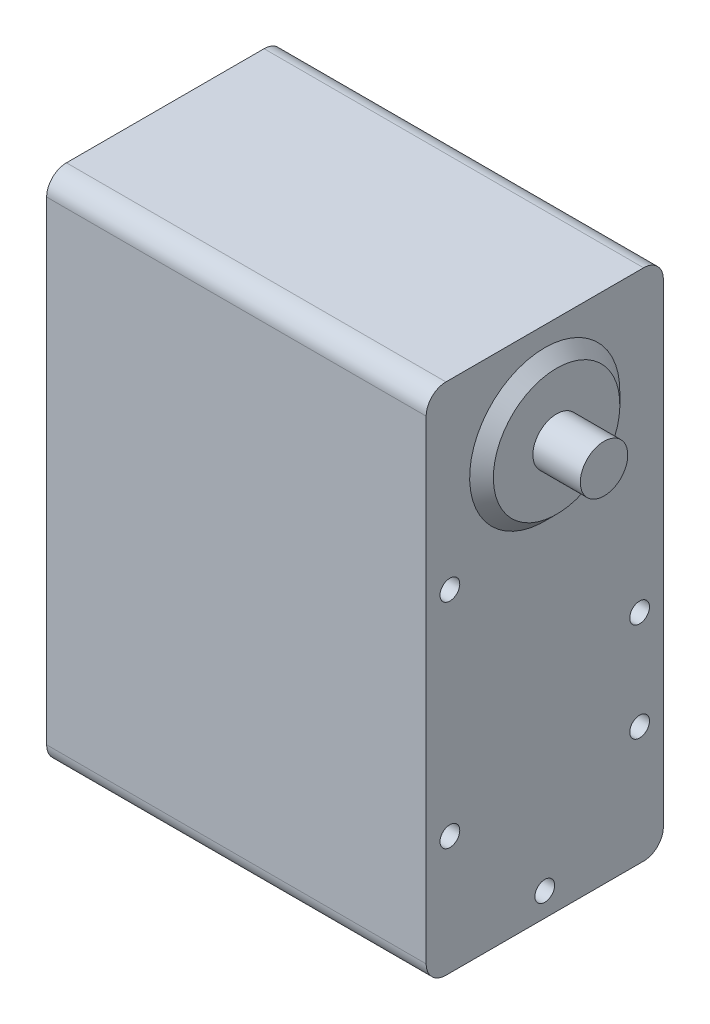
ISO-10303-21;
HEADER;
FILE_DESCRIPTION(('STEP AP214'),'2;1');
FILE_NAME('part.step','',(''),(''),'','','');
FILE_SCHEMA(('AUTOMOTIVE_DESIGN { 1 0 10303 214 1 1 1 1 }'));
ENDSEC;
DATA;
#1=APPLICATION_CONTEXT('core data for automotive mechanical design processes');
#2=APPLICATION_PROTOCOL_DEFINITION('international standard','automotive_design',2000,#1);
#3=PRODUCT_CONTEXT('',#1,'mechanical');
#4=PRODUCT('Part','Part','',(#3));
#5=PRODUCT_RELATED_PRODUCT_CATEGORY('part','',(#4));
#6=PRODUCT_DEFINITION_FORMATION('','',#4);
#7=PRODUCT_DEFINITION_CONTEXT('part definition',#1,'design');
#8=PRODUCT_DEFINITION('design','',#6,#7);
#9=PRODUCT_DEFINITION_SHAPE('','',#8);
#10=(LENGTH_UNIT() NAMED_UNIT(*) SI_UNIT(.MILLI.,.METRE.));
#11=(NAMED_UNIT(*) PLANE_ANGLE_UNIT() SI_UNIT($,.RADIAN.));
#12=(NAMED_UNIT(*) SI_UNIT($,.STERADIAN.) SOLID_ANGLE_UNIT());
#13=UNCERTAINTY_MEASURE_WITH_UNIT(LENGTH_MEASURE(1.E-05),#10,'distance_accuracy_value','');
#14=(GEOMETRIC_REPRESENTATION_CONTEXT(3) GLOBAL_UNCERTAINTY_ASSIGNED_CONTEXT((#13)) GLOBAL_UNIT_ASSIGNED_CONTEXT((#10,
#11,#12)) REPRESENTATION_CONTEXT('',''));
#15=CARTESIAN_POINT('',(0.,0.,0.));
#16=DIRECTION('',(0.,0.,1.));
#17=DIRECTION('',(1.,0.,0.));
#18=AXIS2_PLACEMENT_3D('',#15,#16,#17);
#19=CARTESIAN_POINT('',(-24.,-32.5,-15.));
#20=DIRECTION('',(-1.,0.,0.));
#21=DIRECTION('',(0.,-1.,0.));
#22=AXIS2_PLACEMENT_3D('',#19,#20,#21);
#23=PLANE('',#22);
#24=CARTESIAN_POINT('',(-24.,20.5,0.));
#25=DIRECTION('',(-1.,0.,0.));
#26=DIRECTION('',(0.,-1.,0.));
#27=AXIS2_PLACEMENT_3D('',#24,#25,#26);
#28=CIRCLE('',#27,9.5);
#29=CARTESIAN_POINT('',(-24.,11.,0.));
#30=VERTEX_POINT('',#29);
#31=EDGE_CURVE('E229',#30,#30,#28,.T.);
#32=ORIENTED_EDGE('',*,*,#31,.F.);
#33=EDGE_LOOP('',(#32));
#34=FACE_BOUND('',#33,.T.);
#35=CARTESIAN_POINT('',(-24.,-29.4999999999992,-12.));
#36=DIRECTION('',(-1.,0.,0.));
#37=DIRECTION('',(0.,-1.,0.));
#38=AXIS2_PLACEMENT_3D('',#35,#36,#37);
#39=CIRCLE('',#38,1.25);
#40=CARTESIAN_POINT('',(-24.,-30.7499999999992,-12.));
#41=VERTEX_POINT('',#40);
#42=EDGE_CURVE('E217',#41,#41,#39,.T.);
#43=ORIENTED_EDGE('',*,*,#42,.F.);
#44=EDGE_LOOP('',(#43));
#45=FACE_BOUND('',#44,.T.);
#46=CARTESIAN_POINT('',(-24.,5.50000000000077,-12.));
#47=DIRECTION('',(-1.,0.,0.));
#48=DIRECTION('',(0.,-1.,0.));
#49=AXIS2_PLACEMENT_3D('',#46,#47,#48);
#50=CIRCLE('',#49,1.25);
#51=CARTESIAN_POINT('',(-24.,4.25000000000077,-12.));
#52=VERTEX_POINT('',#51);
#53=EDGE_CURVE('E206',#52,#52,#50,.T.);
#54=ORIENTED_EDGE('',*,*,#53,.F.);
#55=EDGE_LOOP('',(#54));
#56=FACE_BOUND('',#55,.T.);
#57=CARTESIAN_POINT('',(-24.,29.5,-12.));
#58=DIRECTION('',(-1.,0.,0.));
#59=DIRECTION('',(0.,-1.,0.));
#60=AXIS2_PLACEMENT_3D('',#57,#58,#59);
#61=CIRCLE('',#60,1.25);
#62=CARTESIAN_POINT('',(-24.,28.25,-12.));
#63=VERTEX_POINT('',#62);
#64=EDGE_CURVE('E205',#63,#63,#61,.T.);
#65=ORIENTED_EDGE('',*,*,#64,.F.);
#66=EDGE_LOOP('',(#65));
#67=FACE_BOUND('',#66,.T.);
#68=CARTESIAN_POINT('',(-24.,5.50000000000001,12.));
#69=DIRECTION('',(-1.,0.,0.));
#70=DIRECTION('',(0.,-1.,0.));
#71=AXIS2_PLACEMENT_3D('',#68,#69,#70);
#72=CIRCLE('',#71,1.25);
#73=CARTESIAN_POINT('',(-24.,4.25000000000001,12.));
#74=VERTEX_POINT('',#73);
#75=EDGE_CURVE('E199',#74,#74,#72,.T.);
#76=ORIENTED_EDGE('',*,*,#75,.F.);
#77=EDGE_LOOP('',(#76));
#78=FACE_BOUND('',#77,.T.);
#79=CARTESIAN_POINT('',(-24.,-29.4999999999992,12.));
#80=DIRECTION('',(-1.,0.,0.));
#81=DIRECTION('',(0.,-1.,0.));
#82=AXIS2_PLACEMENT_3D('',#79,#80,#81);
#83=CIRCLE('',#82,1.25);
#84=CARTESIAN_POINT('',(-24.,-30.7499999999992,12.));
#85=VERTEX_POINT('',#84);
#86=EDGE_CURVE('E218',#85,#85,#83,.T.);
#87=ORIENTED_EDGE('',*,*,#86,.F.);
#88=EDGE_LOOP('',(#87));
#89=FACE_BOUND('',#88,.T.);
#90=CARTESIAN_POINT('',(-24.,29.5,12.));
#91=DIRECTION('',(-1.,0.,0.));
#92=DIRECTION('',(0.,-1.,0.));
#93=AXIS2_PLACEMENT_3D('',#90,#91,#92);
#94=CIRCLE('',#93,1.25);
#95=CARTESIAN_POINT('',(-24.,28.25,12.));
#96=VERTEX_POINT('',#95);
#97=EDGE_CURVE('E196',#96,#96,#94,.T.);
#98=ORIENTED_EDGE('',*,*,#97,.F.);
#99=EDGE_LOOP('',(#98));
#100=FACE_BOUND('',#99,.T.);
#101=DIRECTION('',(0.,0.,1.));
#102=VECTOR('',#101,1.);
#103=CARTESIAN_POINT('',(-24.,32.5,-15.));
#104=LINE('',#103,#102);
#105=CARTESIAN_POINT('',(-24.,32.5,-12.5));
#106=VERTEX_POINT('',#105);
#107=CARTESIAN_POINT('',(-24.,32.5,12.5));
#108=VERTEX_POINT('',#107);
#109=EDGE_CURVE('E126',#106,#108,#104,.T.);
#110=ORIENTED_EDGE('',*,*,#109,.F.);
#111=CARTESIAN_POINT('',(-24.,30.,-12.5));
#112=DIRECTION('',(-1.,0.,0.));
#113=DIRECTION('',(0.,-1.,0.));
#114=AXIS2_PLACEMENT_3D('',#111,#112,#113);
#115=CIRCLE('',#114,2.5);
#116=CARTESIAN_POINT('',(-24.,30.,-15.));
#117=VERTEX_POINT('',#116);
#118=EDGE_CURVE('E109',#106,#117,#115,.T.);
#119=ORIENTED_EDGE('',*,*,#118,.T.);
#120=DIRECTION('',(0.,-1.,0.));
#121=VECTOR('',#120,1.);
#122=CARTESIAN_POINT('',(-24.,-32.5,-15.));
#123=LINE('',#122,#121);
#124=CARTESIAN_POINT('',(-24.,-30.,-15.));
#125=VERTEX_POINT('',#124);
#126=EDGE_CURVE('E191',#117,#125,#123,.T.);
#127=ORIENTED_EDGE('',*,*,#126,.T.);
#128=CARTESIAN_POINT('',(-24.,-30.,-12.5));
#129=DIRECTION('',(-1.,0.,0.));
#130=DIRECTION('',(0.,-1.,0.));
#131=AXIS2_PLACEMENT_3D('',#128,#129,#130);
#132=CIRCLE('',#131,2.5);
#133=CARTESIAN_POINT('',(-24.,-32.5,-12.5));
#134=VERTEX_POINT('',#133);
#135=EDGE_CURVE('E157',#125,#134,#132,.T.);
#136=ORIENTED_EDGE('',*,*,#135,.T.);
#137=DIRECTION('',(0.,0.,1.));
#138=VECTOR('',#137,1.);
#139=CARTESIAN_POINT('',(-24.,-32.5,-15.));
#140=LINE('',#139,#138);
#141=CARTESIAN_POINT('',(-24.,-32.5,12.5));
#142=VERTEX_POINT('',#141);
#143=EDGE_CURVE('E146',#134,#142,#140,.T.);
#144=ORIENTED_EDGE('',*,*,#143,.T.);
#145=CARTESIAN_POINT('',(-24.,-30.,12.5));
#146=DIRECTION('',(-1.,0.,0.));
#147=DIRECTION('',(0.,-1.,0.));
#148=AXIS2_PLACEMENT_3D('',#145,#146,#147);
#149=CIRCLE('',#148,2.5);
#150=CARTESIAN_POINT('',(-24.,-30.,15.));
#151=VERTEX_POINT('',#150);
#152=EDGE_CURVE('E130',#142,#151,#149,.T.);
#153=ORIENTED_EDGE('',*,*,#152,.T.);
#154=DIRECTION('',(0.,-1.,0.));
#155=VECTOR('',#154,1.);
#156=CARTESIAN_POINT('',(-24.,-32.5,15.));
#157=LINE('',#156,#155);
#158=CARTESIAN_POINT('',(-24.,30.,15.));
#159=VERTEX_POINT('',#158);
#160=EDGE_CURVE('E187',#159,#151,#157,.T.);
#161=ORIENTED_EDGE('',*,*,#160,.F.);
#162=CARTESIAN_POINT('',(-24.,30.,12.5));
#163=DIRECTION('',(-1.,0.,0.));
#164=DIRECTION('',(0.,-1.,0.));
#165=AXIS2_PLACEMENT_3D('',#162,#163,#164);
#166=CIRCLE('',#165,2.5);
#167=EDGE_CURVE('E120',#159,#108,#166,.T.);
#168=ORIENTED_EDGE('',*,*,#167,.T.);
#169=EDGE_LOOP('',(#110,#119,#127,#136,#144,#153,#161,#168));
#170=FACE_BOUND('',#169,.T.);
#171=ADVANCED_FACE('F43',(#34,#45,#56,#67,#78,#89,#100,#170),#23,.T.);
#172=CARTESIAN_POINT('',(-24.,32.5,-15.));
#173=DIRECTION('',(0.,1.,0.));
#174=DIRECTION('',(0.,0.,1.));
#175=AXIS2_PLACEMENT_3D('',#172,#173,#174);
#176=PLANE('',#175);
#177=DIRECTION('',(0.,0.,1.));
#178=VECTOR('',#177,1.);
#179=CARTESIAN_POINT('',(24.,32.5,-15.));
#180=LINE('',#179,#178);
#181=CARTESIAN_POINT('',(24.,32.5,-12.5));
#182=VERTEX_POINT('',#181);
#183=CARTESIAN_POINT('',(24.,32.5,12.5));
#184=VERTEX_POINT('',#183);
#185=EDGE_CURVE('E129',#182,#184,#180,.T.);
#186=ORIENTED_EDGE('',*,*,#185,.F.);
#187=DIRECTION('',(-1.,0.,0.));
#188=VECTOR('',#187,1.);
#189=CARTESIAN_POINT('',(-24.,32.5,-12.5));
#190=LINE('',#189,#188);
#191=EDGE_CURVE('E113',#182,#106,#190,.T.);
#192=ORIENTED_EDGE('',*,*,#191,.T.);
#193=ORIENTED_EDGE('',*,*,#109,.T.);
#194=DIRECTION('',(-1.,0.,0.));
#195=VECTOR('',#194,1.);
#196=CARTESIAN_POINT('',(24.,32.5,12.5));
#197=LINE('',#196,#195);
#198=EDGE_CURVE('E131',#108,#184,#197,.F.);
#199=ORIENTED_EDGE('',*,*,#198,.T.);
#200=EDGE_LOOP('',(#186,#192,#193,#199));
#201=FACE_BOUND('',#200,.T.);
#202=ADVANCED_FACE('F125',(#201),#176,.T.);
#203=CARTESIAN_POINT('',(24.,-32.5,-15.));
#204=DIRECTION('',(1.,0.,0.));
#205=DIRECTION('',(0.,1.,0.));
#206=AXIS2_PLACEMENT_3D('',#203,#204,#205);
#207=PLANE('',#206);
#208=CARTESIAN_POINT('',(24.,9.50000000000001,12.000000020224));
#209=DIRECTION('',(1.,0.,0.));
#210=DIRECTION('',(0.,1.,0.));
#211=AXIS2_PLACEMENT_3D('',#208,#209,#210);
#212=CIRCLE('',#211,1.25);
#213=CARTESIAN_POINT('',(24.,10.75,12.000000020224));
#214=VERTEX_POINT('',#213);
#215=EDGE_CURVE('E270',#214,#214,#212,.T.);
#216=ORIENTED_EDGE('',*,*,#215,.F.);
#217=EDGE_LOOP('',(#216));
#218=FACE_BOUND('',#217,.T.);
#219=CARTESIAN_POINT('',(24.,-17.5,12.0000000202238));
#220=DIRECTION('',(1.,0.,0.));
#221=DIRECTION('',(0.,1.,0.));
#222=AXIS2_PLACEMENT_3D('',#219,#220,#221);
#223=CIRCLE('',#222,1.25);
#224=CARTESIAN_POINT('',(24.,-16.25,12.0000000202238));
#225=VERTEX_POINT('',#224);
#226=EDGE_CURVE('E267',#225,#225,#223,.T.);
#227=ORIENTED_EDGE('',*,*,#226,.F.);
#228=EDGE_LOOP('',(#227));
#229=FACE_BOUND('',#228,.T.);
#230=CARTESIAN_POINT('',(24.,-29.5,0.));
#231=DIRECTION('',(1.,0.,0.));
#232=DIRECTION('',(0.,1.,0.));
#233=AXIS2_PLACEMENT_3D('',#230,#231,#232);
#234=CIRCLE('',#233,1.24999999408708);
#235=CARTESIAN_POINT('',(24.,-28.2500000059129,0.));
#236=VERTEX_POINT('',#235);
#237=EDGE_CURVE('E261',#236,#236,#234,.T.);
#238=ORIENTED_EDGE('',*,*,#237,.F.);
#239=EDGE_LOOP('',(#238));
#240=FACE_BOUND('',#239,.T.);
#241=CARTESIAN_POINT('',(24.,-17.5,-12.0000000202241));
#242=DIRECTION('',(1.,0.,0.));
#243=DIRECTION('',(0.,1.,0.));
#244=AXIS2_PLACEMENT_3D('',#241,#242,#243);
#245=CIRCLE('',#244,1.25000000000001);
#246=CARTESIAN_POINT('',(24.,-16.25,-12.0000000202241));
#247=VERTEX_POINT('',#246);
#248=EDGE_CURVE('E255',#247,#247,#245,.T.);
#249=ORIENTED_EDGE('',*,*,#248,.F.);
#250=EDGE_LOOP('',(#249));
#251=FACE_BOUND('',#250,.T.);
#252=CARTESIAN_POINT('',(24.,-4.99999999999999,-11.9999999797799));
#253=DIRECTION('',(1.,0.,0.));
#254=DIRECTION('',(0.,1.,0.));
#255=AXIS2_PLACEMENT_3D('',#252,#253,#254);
#256=CIRCLE('',#255,1.25);
#257=CARTESIAN_POINT('',(24.,-3.74999999999999,-11.9999999797799));
#258=VERTEX_POINT('',#257);
#259=EDGE_CURVE('E249',#258,#258,#256,.T.);
#260=ORIENTED_EDGE('',*,*,#259,.F.);
#261=EDGE_LOOP('',(#260));
#262=FACE_BOUND('',#261,.T.);
#263=CARTESIAN_POINT('',(24.,20.5,0.));
#264=DIRECTION('',(1.,0.,0.));
#265=DIRECTION('',(0.,1.,0.));
#266=AXIS2_PLACEMENT_3D('',#263,#264,#265);
#267=CIRCLE('',#266,9.5);
#268=CARTESIAN_POINT('',(24.,30.,0.));
#269=VERTEX_POINT('',#268);
#270=EDGE_CURVE('E149',#269,#269,#267,.T.);
#271=ORIENTED_EDGE('',*,*,#270,.F.);
#272=EDGE_LOOP('',(#271));
#273=FACE_BOUND('',#272,.T.);
#274=DIRECTION('',(0.,1.,0.));
#275=VECTOR('',#274,1.);
#276=CARTESIAN_POINT('',(24.,-32.5,-15.));
#277=LINE('',#276,#275);
#278=CARTESIAN_POINT('',(24.,-30.,-15.));
#279=VERTEX_POINT('',#278);
#280=CARTESIAN_POINT('',(24.,30.,-15.));
#281=VERTEX_POINT('',#280);
#282=EDGE_CURVE('E142',#279,#281,#277,.T.);
#283=ORIENTED_EDGE('',*,*,#282,.T.);
#284=CARTESIAN_POINT('',(24.,30.,-12.5));
#285=DIRECTION('',(1.,0.,0.));
#286=DIRECTION('',(0.,1.,0.));
#287=AXIS2_PLACEMENT_3D('',#284,#285,#286);
#288=CIRCLE('',#287,2.5);
#289=EDGE_CURVE('E166',#281,#182,#288,.T.);
#290=ORIENTED_EDGE('',*,*,#289,.T.);
#291=ORIENTED_EDGE('',*,*,#185,.T.);
#292=CARTESIAN_POINT('',(24.,30.,12.5));
#293=DIRECTION('',(1.,0.,0.));
#294=DIRECTION('',(0.,1.,0.));
#295=AXIS2_PLACEMENT_3D('',#292,#293,#294);
#296=CIRCLE('',#295,2.5);
#297=CARTESIAN_POINT('',(24.,30.,15.));
#298=VERTEX_POINT('',#297);
#299=EDGE_CURVE('E164',#184,#298,#296,.T.);
#300=ORIENTED_EDGE('',*,*,#299,.T.);
#301=DIRECTION('',(0.,1.,0.));
#302=VECTOR('',#301,1.);
#303=CARTESIAN_POINT('',(24.,-32.5,15.));
#304=LINE('',#303,#302);
#305=CARTESIAN_POINT('',(24.,-30.,15.));
#306=VERTEX_POINT('',#305);
#307=EDGE_CURVE('E185',#306,#298,#304,.T.);
#308=ORIENTED_EDGE('',*,*,#307,.F.);
#309=CARTESIAN_POINT('',(24.,-30.,12.5));
#310=DIRECTION('',(1.,0.,0.));
#311=DIRECTION('',(0.,1.,0.));
#312=AXIS2_PLACEMENT_3D('',#309,#310,#311);
#313=CIRCLE('',#312,2.5);
#314=CARTESIAN_POINT('',(24.,-32.5,12.5));
#315=VERTEX_POINT('',#314);
#316=EDGE_CURVE('E58',#306,#315,#313,.T.);
#317=ORIENTED_EDGE('',*,*,#316,.T.);
#318=DIRECTION('',(0.,0.,1.));
#319=VECTOR('',#318,1.);
#320=CARTESIAN_POINT('',(24.,-32.5,-15.));
#321=LINE('',#320,#319);
#322=CARTESIAN_POINT('',(24.,-32.5,-12.5));
#323=VERTEX_POINT('',#322);
#324=EDGE_CURVE('E139',#323,#315,#321,.T.);
#325=ORIENTED_EDGE('',*,*,#324,.F.);
#326=CARTESIAN_POINT('',(24.,-30.,-12.5));
#327=DIRECTION('',(1.,0.,0.));
#328=DIRECTION('',(0.,1.,0.));
#329=AXIS2_PLACEMENT_3D('',#326,#327,#328);
#330=CIRCLE('',#329,2.5);
#331=EDGE_CURVE('E66',#323,#279,#330,.T.);
#332=ORIENTED_EDGE('',*,*,#331,.T.);
#333=EDGE_LOOP('',(#283,#290,#291,#300,#308,#317,#325,#332));
#334=FACE_BOUND('',#333,.T.);
#335=ADVANCED_FACE('F189',(#218,#229,#240,#251,#262,#273,#334),#207,.T.);
#336=CARTESIAN_POINT('',(-24.,-32.5,-15.));
#337=DIRECTION('',(0.,-1.,0.));
#338=DIRECTION('',(0.,0.,-1.));
#339=AXIS2_PLACEMENT_3D('',#336,#337,#338);
#340=PLANE('',#339);
#341=ORIENTED_EDGE('',*,*,#143,.F.);
#342=DIRECTION('',(1.,0.,0.));
#343=VECTOR('',#342,1.);
#344=CARTESIAN_POINT('',(-24.,-32.5,-12.5));
#345=LINE('',#344,#343);
#346=EDGE_CURVE('E11',#134,#323,#345,.T.);
#347=ORIENTED_EDGE('',*,*,#346,.T.);
#348=ORIENTED_EDGE('',*,*,#324,.T.);
#349=DIRECTION('',(1.,0.,0.));
#350=VECTOR('',#349,1.);
#351=CARTESIAN_POINT('',(-24.,-32.5,12.5));
#352=LINE('',#351,#350);
#353=EDGE_CURVE('E51',#315,#142,#352,.F.);
#354=ORIENTED_EDGE('',*,*,#353,.T.);
#355=EDGE_LOOP('',(#341,#347,#348,#354));
#356=FACE_BOUND('',#355,.T.);
#357=ADVANCED_FACE('F176',(#356),#340,.T.);
#358=CARTESIAN_POINT('',(0.,0.,-15.));
#359=DIRECTION('',(0.,0.,-1.));
#360=DIRECTION('',(-1.,0.,0.));
#361=AXIS2_PLACEMENT_3D('',#358,#359,#360);
#362=PLANE('',#361);
#363=ORIENTED_EDGE('',*,*,#126,.F.);
#364=DIRECTION('',(-1.,0.,0.));
#365=VECTOR('',#364,1.);
#366=CARTESIAN_POINT('',(0.,30.,-15.));
#367=LINE('',#366,#365);
#368=EDGE_CURVE('E114',#117,#281,#367,.F.);
#369=ORIENTED_EDGE('',*,*,#368,.T.);
#370=ORIENTED_EDGE('',*,*,#282,.F.);
#371=DIRECTION('',(1.,0.,0.));
#372=VECTOR('',#371,1.);
#373=CARTESIAN_POINT('',(0.,-30.,-15.));
#374=LINE('',#373,#372);
#375=EDGE_CURVE('E119',#279,#125,#374,.F.);
#376=ORIENTED_EDGE('',*,*,#375,.T.);
#377=EDGE_LOOP('',(#363,#369,#370,#376));
#378=FACE_BOUND('',#377,.T.);
#379=ADVANCED_FACE('F402',(#378),#362,.T.);
#380=CARTESIAN_POINT('',(0.,0.,15.));
#381=DIRECTION('',(0.,0.,-1.));
#382=DIRECTION('',(-1.,0.,0.));
#383=AXIS2_PLACEMENT_3D('',#380,#381,#382);
#384=PLANE('',#383);
#385=ORIENTED_EDGE('',*,*,#307,.T.);
#386=DIRECTION('',(-1.,0.,0.));
#387=VECTOR('',#386,1.);
#388=CARTESIAN_POINT('',(-24.,30.,15.));
#389=LINE('',#388,#387);
#390=EDGE_CURVE('E171',#298,#159,#389,.T.);
#391=ORIENTED_EDGE('',*,*,#390,.T.);
#392=ORIENTED_EDGE('',*,*,#160,.T.);
#393=DIRECTION('',(1.,0.,0.));
#394=VECTOR('',#393,1.);
#395=CARTESIAN_POINT('',(24.,-30.,15.));
#396=LINE('',#395,#394);
#397=EDGE_CURVE('E168',#151,#306,#396,.T.);
#398=ORIENTED_EDGE('',*,*,#397,.T.);
#399=EDGE_LOOP('',(#385,#391,#392,#398));
#400=FACE_BOUND('',#399,.T.);
#401=ADVANCED_FACE('F184',(#400),#384,.F.);
#402=CARTESIAN_POINT('',(-14.,29.5,12.));
#403=DIRECTION('',(-1.,0.,0.));
#404=DIRECTION('',(0.,-1.,0.));
#405=AXIS2_PLACEMENT_3D('',#402,#403,#404);
#406=CYLINDRICAL_SURFACE('',#405,1.25);
#407=CARTESIAN_POINT('',(-14.,29.5,12.));
#408=DIRECTION('',(-1.,0.,0.));
#409=DIRECTION('',(0.,-1.,0.));
#410=AXIS2_PLACEMENT_3D('',#407,#408,#409);
#411=CIRCLE('',#410,1.25);
#412=CARTESIAN_POINT('',(-14.,28.25,12.));
#413=VERTEX_POINT('',#412);
#414=EDGE_CURVE('E193',#413,#413,#411,.T.);
#415=ORIENTED_EDGE('',*,*,#414,.F.);
#416=EDGE_LOOP('',(#415));
#417=FACE_BOUND('',#416,.T.);
#418=ORIENTED_EDGE('',*,*,#97,.T.);
#419=EDGE_LOOP('',(#418));
#420=FACE_BOUND('',#419,.T.);
#421=ADVANCED_FACE('F395',(#417,#420),#406,.F.);
#422=CARTESIAN_POINT('',(-14.,29.5,12.));
#423=DIRECTION('',(-1.,0.,0.));
#424=DIRECTION('',(0.,-1.,0.));
#425=AXIS2_PLACEMENT_3D('',#422,#423,#424);
#426=PLANE('',#425);
#427=ORIENTED_EDGE('',*,*,#414,.T.);
#428=EDGE_LOOP('',(#427));
#429=FACE_BOUND('',#428,.T.);
#430=ADVANCED_FACE('F361',(#429),#426,.T.);
#431=CARTESIAN_POINT('',(-14.,-29.4999999999992,12.));
#432=DIRECTION('',(-1.,0.,0.));
#433=DIRECTION('',(0.,-1.,0.));
#434=AXIS2_PLACEMENT_3D('',#431,#432,#433);
#435=CYLINDRICAL_SURFACE('',#434,1.25);
#436=CARTESIAN_POINT('',(-14.,-29.4999999999992,12.));
#437=DIRECTION('',(-1.,0.,0.));
#438=DIRECTION('',(0.,-1.,0.));
#439=AXIS2_PLACEMENT_3D('',#436,#437,#438);
#440=CIRCLE('',#439,1.25);
#441=CARTESIAN_POINT('',(-14.,-30.7499999999992,12.));
#442=VERTEX_POINT('',#441);
#443=EDGE_CURVE('E226',#442,#442,#440,.T.);
#444=ORIENTED_EDGE('',*,*,#443,.F.);
#445=EDGE_LOOP('',(#444));
#446=FACE_BOUND('',#445,.T.);
#447=ORIENTED_EDGE('',*,*,#86,.T.);
#448=EDGE_LOOP('',(#447));
#449=FACE_BOUND('',#448,.T.);
#450=ADVANCED_FACE('F357',(#446,#449),#435,.F.);
#451=CARTESIAN_POINT('',(-14.,-29.4999999999992,12.));
#452=DIRECTION('',(-1.,0.,0.));
#453=DIRECTION('',(0.,-1.,0.));
#454=AXIS2_PLACEMENT_3D('',#451,#452,#453);
#455=PLANE('',#454);
#456=ORIENTED_EDGE('',*,*,#443,.T.);
#457=EDGE_LOOP('',(#456));
#458=FACE_BOUND('',#457,.T.);
#459=ADVANCED_FACE('F360',(#458),#455,.T.);
#460=CARTESIAN_POINT('',(-14.,5.50000000000001,12.));
#461=DIRECTION('',(-1.,0.,0.));
#462=DIRECTION('',(0.,-1.,0.));
#463=AXIS2_PLACEMENT_3D('',#460,#461,#462);
#464=CYLINDRICAL_SURFACE('',#463,1.25);
#465=CARTESIAN_POINT('',(-14.,5.50000000000001,12.));
#466=DIRECTION('',(-1.,0.,0.));
#467=DIRECTION('',(0.,-1.,0.));
#468=AXIS2_PLACEMENT_3D('',#465,#466,#467);
#469=CIRCLE('',#468,1.25);
#470=CARTESIAN_POINT('',(-14.,4.25000000000001,12.));
#471=VERTEX_POINT('',#470);
#472=EDGE_CURVE('E209',#471,#471,#469,.T.);
#473=ORIENTED_EDGE('',*,*,#472,.F.);
#474=EDGE_LOOP('',(#473));
#475=FACE_BOUND('',#474,.T.);
#476=ORIENTED_EDGE('',*,*,#75,.T.);
#477=EDGE_LOOP('',(#476));
#478=FACE_BOUND('',#477,.T.);
#479=ADVANCED_FACE('F365',(#475,#478),#464,.F.);
#480=CARTESIAN_POINT('',(-14.,5.50000000000001,12.));
#481=DIRECTION('',(-1.,0.,0.));
#482=DIRECTION('',(0.,-1.,0.));
#483=AXIS2_PLACEMENT_3D('',#480,#481,#482);
#484=PLANE('',#483);
#485=ORIENTED_EDGE('',*,*,#472,.T.);
#486=EDGE_LOOP('',(#485));
#487=FACE_BOUND('',#486,.T.);
#488=ADVANCED_FACE('F381',(#487),#484,.T.);
#489=CARTESIAN_POINT('',(-14.,29.5,-12.));
#490=DIRECTION('',(-1.,0.,0.));
#491=DIRECTION('',(0.,-1.,0.));
#492=AXIS2_PLACEMENT_3D('',#489,#490,#491);
#493=CYLINDRICAL_SURFACE('',#492,1.25);
#494=CARTESIAN_POINT('',(-14.,29.5,-12.));
#495=DIRECTION('',(-1.,0.,0.));
#496=DIRECTION('',(0.,-1.,0.));
#497=AXIS2_PLACEMENT_3D('',#494,#495,#496);
#498=CIRCLE('',#497,1.25);
#499=CARTESIAN_POINT('',(-14.,28.25,-12.));
#500=VERTEX_POINT('',#499);
#501=EDGE_CURVE('E202',#500,#500,#498,.T.);
#502=ORIENTED_EDGE('',*,*,#501,.F.);
#503=EDGE_LOOP('',(#502));
#504=FACE_BOUND('',#503,.T.);
#505=ORIENTED_EDGE('',*,*,#64,.T.);
#506=EDGE_LOOP('',(#505));
#507=FACE_BOUND('',#506,.T.);
#508=ADVANCED_FACE('F385',(#504,#507),#493,.F.);
#509=CARTESIAN_POINT('',(-14.,29.5,-12.));
#510=DIRECTION('',(-1.,0.,0.));
#511=DIRECTION('',(0.,-1.,0.));
#512=AXIS2_PLACEMENT_3D('',#509,#510,#511);
#513=PLANE('',#512);
#514=ORIENTED_EDGE('',*,*,#501,.T.);
#515=EDGE_LOOP('',(#514));
#516=FACE_BOUND('',#515,.T.);
#517=ADVANCED_FACE('F371',(#516),#513,.T.);
#518=CARTESIAN_POINT('',(-14.,5.50000000000077,-12.));
#519=DIRECTION('',(-1.,0.,0.));
#520=DIRECTION('',(0.,-1.,0.));
#521=AXIS2_PLACEMENT_3D('',#518,#519,#520);
#522=CYLINDRICAL_SURFACE('',#521,1.25);
#523=CARTESIAN_POINT('',(-14.,5.50000000000077,-12.));
#524=DIRECTION('',(-1.,0.,0.));
#525=DIRECTION('',(0.,-1.,0.));
#526=AXIS2_PLACEMENT_3D('',#523,#524,#525);
#527=CIRCLE('',#526,1.25);
#528=CARTESIAN_POINT('',(-14.,4.25000000000077,-12.));
#529=VERTEX_POINT('',#528);
#530=EDGE_CURVE('E221',#529,#529,#527,.T.);
#531=ORIENTED_EDGE('',*,*,#530,.F.);
#532=EDGE_LOOP('',(#531));
#533=FACE_BOUND('',#532,.T.);
#534=ORIENTED_EDGE('',*,*,#53,.T.);
#535=EDGE_LOOP('',(#534));
#536=FACE_BOUND('',#535,.T.);
#537=ADVANCED_FACE('F367',(#533,#536),#522,.F.);
#538=CARTESIAN_POINT('',(-14.,5.50000000000077,-12.));
#539=DIRECTION('',(-1.,0.,0.));
#540=DIRECTION('',(0.,-1.,0.));
#541=AXIS2_PLACEMENT_3D('',#538,#539,#540);
#542=PLANE('',#541);
#543=ORIENTED_EDGE('',*,*,#530,.T.);
#544=EDGE_LOOP('',(#543));
#545=FACE_BOUND('',#544,.T.);
#546=ADVANCED_FACE('F370',(#545),#542,.T.);
#547=CARTESIAN_POINT('',(-14.,-29.4999999999992,-12.));
#548=DIRECTION('',(-1.,0.,0.));
#549=DIRECTION('',(0.,-1.,0.));
#550=AXIS2_PLACEMENT_3D('',#547,#548,#549);
#551=CYLINDRICAL_SURFACE('',#550,1.25);
#552=CARTESIAN_POINT('',(-14.,-29.4999999999992,-12.));
#553=DIRECTION('',(-1.,0.,0.));
#554=DIRECTION('',(0.,-1.,0.));
#555=AXIS2_PLACEMENT_3D('',#552,#553,#554);
#556=CIRCLE('',#555,1.25);
#557=CARTESIAN_POINT('',(-14.,-30.7499999999992,-12.));
#558=VERTEX_POINT('',#557);
#559=EDGE_CURVE('E214',#558,#558,#556,.T.);
#560=ORIENTED_EDGE('',*,*,#559,.F.);
#561=EDGE_LOOP('',(#560));
#562=FACE_BOUND('',#561,.T.);
#563=ORIENTED_EDGE('',*,*,#42,.T.);
#564=EDGE_LOOP('',(#563));
#565=FACE_BOUND('',#564,.T.);
#566=ADVANCED_FACE('F351',(#562,#565),#551,.F.);
#567=CARTESIAN_POINT('',(-14.,-29.4999999999992,-12.));
#568=DIRECTION('',(-1.,0.,0.));
#569=DIRECTION('',(0.,-1.,0.));
#570=AXIS2_PLACEMENT_3D('',#567,#568,#569);
#571=PLANE('',#570);
#572=ORIENTED_EDGE('',*,*,#559,.T.);
#573=EDGE_LOOP('',(#572));
#574=FACE_BOUND('',#573,.T.);
#575=ADVANCED_FACE('F342',(#574),#571,.T.);
#576=CARTESIAN_POINT('',(-25.5,0.,0.));
#577=DIRECTION('',(-1.,0.,0.));
#578=DIRECTION('',(0.,-1.,0.));
#579=AXIS2_PLACEMENT_3D('',#576,#577,#578);
#580=PLANE('',#579);
#581=CARTESIAN_POINT('',(-25.5,20.5,0.));
#582=DIRECTION('',(-1.,0.,0.));
#583=DIRECTION('',(0.,-1.,0.));
#584=AXIS2_PLACEMENT_3D('',#581,#582,#583);
#585=CIRCLE('',#584,3.);
#586=CARTESIAN_POINT('',(-25.5,17.5,0.));
#587=VERTEX_POINT('',#586);
#588=EDGE_CURVE('E137',#587,#587,#585,.T.);
#589=ORIENTED_EDGE('',*,*,#588,.F.);
#590=EDGE_LOOP('',(#589));
#591=FACE_BOUND('',#590,.T.);
#592=CARTESIAN_POINT('',(-25.5,20.5,0.));
#593=DIRECTION('',(-1.,0.,0.));
#594=DIRECTION('',(0.,-1.,0.));
#595=AXIS2_PLACEMENT_3D('',#592,#593,#594);
#596=CIRCLE('',#595,8.00000000000001);
#597=CARTESIAN_POINT('',(-25.5,12.5,0.));
#598=VERTEX_POINT('',#597);
#599=EDGE_CURVE('E134',#598,#598,#596,.T.);
#600=ORIENTED_EDGE('',*,*,#599,.T.);
#601=EDGE_LOOP('',(#600));
#602=FACE_BOUND('',#601,.T.);
#603=ADVANCED_FACE('F334',(#591,#602),#580,.T.);
#604=CARTESIAN_POINT('',(-25.5,20.5,0.));
#605=DIRECTION('',(1.,0.,0.));
#606=DIRECTION('',(0.,0.,-1.));
#607=AXIS2_PLACEMENT_3D('',#604,#605,#606);
#608=CONICAL_SURFACE('',#607,8.00000000000001,0.785398163397444);
#609=ORIENTED_EDGE('',*,*,#31,.T.);
#610=EDGE_LOOP('',(#609));
#611=FACE_BOUND('',#610,.T.);
#612=ORIENTED_EDGE('',*,*,#599,.F.);
#613=EDGE_LOOP('',(#612));
#614=FACE_BOUND('',#613,.T.);
#615=ADVANCED_FACE('F329',(#611,#614),#608,.T.);
#616=CARTESIAN_POINT('',(-31.5,20.5,0.));
#617=DIRECTION('',(1.,0.,0.));
#618=DIRECTION('',(0.,1.,0.));
#619=AXIS2_PLACEMENT_3D('',#616,#617,#618);
#620=CYLINDRICAL_SURFACE('',#619,3.);
#621=CARTESIAN_POINT('',(-31.5,20.5,0.));
#622=DIRECTION('',(-1.,0.,0.));
#623=DIRECTION('',(0.,-1.,0.));
#624=AXIS2_PLACEMENT_3D('',#621,#622,#623);
#625=CIRCLE('',#624,3.);
#626=CARTESIAN_POINT('',(-31.5,17.5,0.));
#627=VERTEX_POINT('',#626);
#628=EDGE_CURVE('E234',#627,#627,#625,.T.);
#629=ORIENTED_EDGE('',*,*,#628,.F.);
#630=EDGE_LOOP('',(#629));
#631=FACE_BOUND('',#630,.T.);
#632=ORIENTED_EDGE('',*,*,#588,.T.);
#633=EDGE_LOOP('',(#632));
#634=FACE_BOUND('',#633,.T.);
#635=ADVANCED_FACE('F333',(#631,#634),#620,.T.);
#636=CARTESIAN_POINT('',(-31.5,20.5,0.));
#637=DIRECTION('',(-1.,0.,0.));
#638=DIRECTION('',(0.,-1.,0.));
#639=AXIS2_PLACEMENT_3D('',#636,#637,#638);
#640=PLANE('',#639);
#641=ORIENTED_EDGE('',*,*,#628,.T.);
#642=EDGE_LOOP('',(#641));
#643=FACE_BOUND('',#642,.T.);
#644=ADVANCED_FACE('F311',(#643),#640,.T.);
#645=CARTESIAN_POINT('',(25.5,0.,0.));
#646=DIRECTION('',(1.,0.,0.));
#647=DIRECTION('',(0.,-1.,0.));
#648=AXIS2_PLACEMENT_3D('',#645,#646,#647);
#649=PLANE('',#648);
#650=CARTESIAN_POINT('',(25.5,20.5,0.));
#651=DIRECTION('',(-1.,0.,0.));
#652=DIRECTION('',(0.,-1.,0.));
#653=AXIS2_PLACEMENT_3D('',#650,#651,#652);
#654=CIRCLE('',#653,3.);
#655=CARTESIAN_POINT('',(25.5,17.5,0.));
#656=VERTEX_POINT('',#655);
#657=EDGE_CURVE('E240',#656,#656,#654,.T.);
#658=ORIENTED_EDGE('',*,*,#657,.T.);
#659=EDGE_LOOP('',(#658));
#660=FACE_BOUND('',#659,.T.);
#661=CARTESIAN_POINT('',(25.5,20.5,0.));
#662=DIRECTION('',(1.,0.,0.));
#663=DIRECTION('',(0.,1.,0.));
#664=AXIS2_PLACEMENT_3D('',#661,#662,#663);
#665=CIRCLE('',#664,7.99999999999999);
#666=CARTESIAN_POINT('',(25.5,28.5,0.));
#667=VERTEX_POINT('',#666);
#668=EDGE_CURVE('E152',#667,#667,#665,.T.);
#669=ORIENTED_EDGE('',*,*,#668,.T.);
#670=EDGE_LOOP('',(#669));
#671=FACE_BOUND('',#670,.T.);
#672=ADVANCED_FACE('F301',(#660,#671),#649,.T.);
#673=CARTESIAN_POINT('',(24.,20.5,0.));
#674=DIRECTION('',(-1.,0.,0.));
#675=DIRECTION('',(0.,0.,1.));
#676=AXIS2_PLACEMENT_3D('',#673,#674,#675);
#677=CONICAL_SURFACE('',#676,9.5,0.785398163397443);
#678=ORIENTED_EDGE('',*,*,#668,.F.);
#679=EDGE_LOOP('',(#678));
#680=FACE_BOUND('',#679,.T.);
#681=ORIENTED_EDGE('',*,*,#270,.T.);
#682=EDGE_LOOP('',(#681));
#683=FACE_BOUND('',#682,.T.);
#684=ADVANCED_FACE('F298',(#680,#683),#677,.T.);
#685=CARTESIAN_POINT('',(31.5,20.5,0.));
#686=DIRECTION('',(-1.,0.,0.));
#687=DIRECTION('',(0.,-1.,0.));
#688=AXIS2_PLACEMENT_3D('',#685,#686,#687);
#689=CYLINDRICAL_SURFACE('',#688,3.);
#690=CARTESIAN_POINT('',(31.5,20.5,0.));
#691=DIRECTION('',(-1.,0.,0.));
#692=DIRECTION('',(0.,-1.,0.));
#693=AXIS2_PLACEMENT_3D('',#690,#691,#692);
#694=CIRCLE('',#693,3.);
#695=CARTESIAN_POINT('',(31.5,17.5,0.));
#696=VERTEX_POINT('',#695);
#697=EDGE_CURVE('E239',#696,#696,#694,.T.);
#698=ORIENTED_EDGE('',*,*,#697,.T.);
#699=EDGE_LOOP('',(#698));
#700=FACE_BOUND('',#699,.T.);
#701=ORIENTED_EDGE('',*,*,#657,.F.);
#702=EDGE_LOOP('',(#701));
#703=FACE_BOUND('',#702,.T.);
#704=ADVANCED_FACE('F300',(#700,#703),#689,.T.);
#705=CARTESIAN_POINT('',(31.5,20.5,0.));
#706=DIRECTION('',(1.,0.,0.));
#707=DIRECTION('',(0.,-1.,0.));
#708=AXIS2_PLACEMENT_3D('',#705,#706,#707);
#709=PLANE('',#708);
#710=ORIENTED_EDGE('',*,*,#697,.F.);
#711=EDGE_LOOP('',(#710));
#712=FACE_BOUND('',#711,.T.);
#713=ADVANCED_FACE('F308',(#712),#709,.T.);
#714=CARTESIAN_POINT('',(14.,-4.99999999999999,-11.9999999797799));
#715=DIRECTION('',(1.,0.,0.));
#716=DIRECTION('',(0.,1.,0.));
#717=AXIS2_PLACEMENT_3D('',#714,#715,#716);
#718=CYLINDRICAL_SURFACE('',#717,1.25);
#719=CARTESIAN_POINT('',(14.,-4.99999999999999,-11.9999999797799));
#720=DIRECTION('',(1.,0.,0.));
#721=DIRECTION('',(0.,1.,0.));
#722=AXIS2_PLACEMENT_3D('',#719,#720,#721);
#723=CIRCLE('',#722,1.25);
#724=CARTESIAN_POINT('',(14.,-3.74999999999999,-11.9999999797799));
#725=VERTEX_POINT('',#724);
#726=EDGE_CURVE('E246',#725,#725,#723,.T.);
#727=ORIENTED_EDGE('',*,*,#726,.F.);
#728=EDGE_LOOP('',(#727));
#729=FACE_BOUND('',#728,.T.);
#730=ORIENTED_EDGE('',*,*,#259,.T.);
#731=EDGE_LOOP('',(#730));
#732=FACE_BOUND('',#731,.T.);
#733=ADVANCED_FACE('F449',(#729,#732),#718,.F.);
#734=CARTESIAN_POINT('',(14.,-4.99999999999999,-11.9999999797799));
#735=DIRECTION('',(1.,0.,0.));
#736=DIRECTION('',(0.,1.,0.));
#737=AXIS2_PLACEMENT_3D('',#734,#735,#736);
#738=PLANE('',#737);
#739=ORIENTED_EDGE('',*,*,#726,.T.);
#740=EDGE_LOOP('',(#739));
#741=FACE_BOUND('',#740,.T.);
#742=ADVANCED_FACE('F444',(#741),#738,.T.);
#743=CARTESIAN_POINT('',(14.,-17.5,-12.0000000202241));
#744=DIRECTION('',(1.,0.,0.));
#745=DIRECTION('',(0.,1.,0.));
#746=AXIS2_PLACEMENT_3D('',#743,#744,#745);
#747=CYLINDRICAL_SURFACE('',#746,1.25000000000001);
#748=CARTESIAN_POINT('',(14.,-17.5,-12.0000000202241));
#749=DIRECTION('',(1.,0.,0.));
#750=DIRECTION('',(0.,1.,0.));
#751=AXIS2_PLACEMENT_3D('',#748,#749,#750);
#752=CIRCLE('',#751,1.25000000000001);
#753=CARTESIAN_POINT('',(14.,-16.25,-12.0000000202241));
#754=VERTEX_POINT('',#753);
#755=EDGE_CURVE('E252',#754,#754,#752,.T.);
#756=ORIENTED_EDGE('',*,*,#755,.F.);
#757=EDGE_LOOP('',(#756));
#758=FACE_BOUND('',#757,.T.);
#759=ORIENTED_EDGE('',*,*,#248,.T.);
#760=EDGE_LOOP('',(#759));
#761=FACE_BOUND('',#760,.T.);
#762=ADVANCED_FACE('F441',(#758,#761),#747,.F.);
#763=CARTESIAN_POINT('',(14.,-17.5,-12.0000000202241));
#764=DIRECTION('',(1.,0.,0.));
#765=DIRECTION('',(0.,1.,0.));
#766=AXIS2_PLACEMENT_3D('',#763,#764,#765);
#767=PLANE('',#766);
#768=ORIENTED_EDGE('',*,*,#755,.T.);
#769=EDGE_LOOP('',(#768));
#770=FACE_BOUND('',#769,.T.);
#771=ADVANCED_FACE('F436',(#770),#767,.T.);
#772=CARTESIAN_POINT('',(14.,-29.5,0.));
#773=DIRECTION('',(1.,0.,0.));
#774=DIRECTION('',(0.,1.,0.));
#775=AXIS2_PLACEMENT_3D('',#772,#773,#774);
#776=CYLINDRICAL_SURFACE('',#775,1.24999999408708);
#777=CARTESIAN_POINT('',(14.,-29.5,0.));
#778=DIRECTION('',(1.,0.,0.));
#779=DIRECTION('',(0.,1.,0.));
#780=AXIS2_PLACEMENT_3D('',#777,#778,#779);
#781=CIRCLE('',#780,1.24999999408708);
#782=CARTESIAN_POINT('',(14.,-28.2500000059129,0.));
#783=VERTEX_POINT('',#782);
#784=EDGE_CURVE('E258',#783,#783,#781,.T.);
#785=ORIENTED_EDGE('',*,*,#784,.F.);
#786=EDGE_LOOP('',(#785));
#787=FACE_BOUND('',#786,.T.);
#788=ORIENTED_EDGE('',*,*,#237,.T.);
#789=EDGE_LOOP('',(#788));
#790=FACE_BOUND('',#789,.T.);
#791=ADVANCED_FACE('F433',(#787,#790),#776,.F.);
#792=CARTESIAN_POINT('',(14.,-29.5,0.));
#793=DIRECTION('',(1.,0.,0.));
#794=DIRECTION('',(0.,1.,0.));
#795=AXIS2_PLACEMENT_3D('',#792,#793,#794);
#796=PLANE('',#795);
#797=ORIENTED_EDGE('',*,*,#784,.T.);
#798=EDGE_LOOP('',(#797));
#799=FACE_BOUND('',#798,.T.);
#800=ADVANCED_FACE('F428',(#799),#796,.T.);
#801=CARTESIAN_POINT('',(14.,-17.5,12.0000000202238));
#802=DIRECTION('',(1.,0.,0.));
#803=DIRECTION('',(0.,1.,0.));
#804=AXIS2_PLACEMENT_3D('',#801,#802,#803);
#805=CYLINDRICAL_SURFACE('',#804,1.25);
#806=CARTESIAN_POINT('',(14.,-17.5,12.0000000202238));
#807=DIRECTION('',(1.,0.,0.));
#808=DIRECTION('',(0.,1.,0.));
#809=AXIS2_PLACEMENT_3D('',#806,#807,#808);
#810=CIRCLE('',#809,1.25);
#811=CARTESIAN_POINT('',(14.,-16.25,12.0000000202238));
#812=VERTEX_POINT('',#811);
#813=EDGE_CURVE('E264',#812,#812,#810,.T.);
#814=ORIENTED_EDGE('',*,*,#813,.F.);
#815=EDGE_LOOP('',(#814));
#816=FACE_BOUND('',#815,.T.);
#817=ORIENTED_EDGE('',*,*,#226,.T.);
#818=EDGE_LOOP('',(#817));
#819=FACE_BOUND('',#818,.T.);
#820=ADVANCED_FACE('F425',(#816,#819),#805,.F.);
#821=CARTESIAN_POINT('',(14.,-17.5,12.0000000202238));
#822=DIRECTION('',(1.,0.,0.));
#823=DIRECTION('',(0.,1.,0.));
#824=AXIS2_PLACEMENT_3D('',#821,#822,#823);
#825=PLANE('',#824);
#826=ORIENTED_EDGE('',*,*,#813,.T.);
#827=EDGE_LOOP('',(#826));
#828=FACE_BOUND('',#827,.T.);
#829=ADVANCED_FACE('F281',(#828),#825,.T.);
#830=CARTESIAN_POINT('',(14.,9.50000000000001,12.000000020224));
#831=DIRECTION('',(1.,0.,0.));
#832=DIRECTION('',(0.,1.,0.));
#833=AXIS2_PLACEMENT_3D('',#830,#831,#832);
#834=CYLINDRICAL_SURFACE('',#833,1.25);
#835=CARTESIAN_POINT('',(14.,9.50000000000001,12.000000020224));
#836=DIRECTION('',(1.,0.,0.));
#837=DIRECTION('',(0.,1.,0.));
#838=AXIS2_PLACEMENT_3D('',#835,#836,#837);
#839=CIRCLE('',#838,1.25);
#840=CARTESIAN_POINT('',(14.,10.75,12.000000020224));
#841=VERTEX_POINT('',#840);
#842=EDGE_CURVE('E243',#841,#841,#839,.T.);
#843=ORIENTED_EDGE('',*,*,#842,.F.);
#844=EDGE_LOOP('',(#843));
#845=FACE_BOUND('',#844,.T.);
#846=ORIENTED_EDGE('',*,*,#215,.T.);
#847=EDGE_LOOP('',(#846));
#848=FACE_BOUND('',#847,.T.);
#849=ADVANCED_FACE('F278',(#845,#848),#834,.F.);
#850=CARTESIAN_POINT('',(14.,9.50000000000001,12.000000020224));
#851=DIRECTION('',(1.,0.,0.));
#852=DIRECTION('',(0.,1.,0.));
#853=AXIS2_PLACEMENT_3D('',#850,#851,#852);
#854=PLANE('',#853);
#855=ORIENTED_EDGE('',*,*,#842,.T.);
#856=EDGE_LOOP('',(#855));
#857=FACE_BOUND('',#856,.T.);
#858=ADVANCED_FACE('F276',(#857),#854,.T.);
#859=CARTESIAN_POINT('',(-24.,30.,-12.5));
#860=DIRECTION('',(-1.,0.,0.));
#861=DIRECTION('',(0.,0.,1.));
#862=AXIS2_PLACEMENT_3D('',#859,#860,#861);
#863=CYLINDRICAL_SURFACE('',#862,2.5);
#864=ORIENTED_EDGE('',*,*,#289,.F.);
#865=ORIENTED_EDGE('',*,*,#368,.F.);
#866=ORIENTED_EDGE('',*,*,#118,.F.);
#867=ORIENTED_EDGE('',*,*,#191,.F.);
#868=EDGE_LOOP('',(#864,#865,#866,#867));
#869=FACE_BOUND('',#868,.T.);
#870=ADVANCED_FACE('F112',(#869),#863,.T.);
#871=CARTESIAN_POINT('',(0.,30.,12.5));
#872=DIRECTION('',(1.,0.,0.));
#873=DIRECTION('',(0.,0.,-1.));
#874=AXIS2_PLACEMENT_3D('',#871,#872,#873);
#875=CYLINDRICAL_SURFACE('',#874,2.5);
#876=ORIENTED_EDGE('',*,*,#299,.F.);
#877=ORIENTED_EDGE('',*,*,#198,.F.);
#878=ORIENTED_EDGE('',*,*,#167,.F.);
#879=ORIENTED_EDGE('',*,*,#390,.F.);
#880=EDGE_LOOP('',(#876,#877,#878,#879));
#881=FACE_BOUND('',#880,.T.);
#882=ADVANCED_FACE('F411',(#881),#875,.T.);
#883=CARTESIAN_POINT('',(-24.,-30.,-12.5));
#884=DIRECTION('',(1.,0.,0.));
#885=DIRECTION('',(0.,0.,-1.));
#886=AXIS2_PLACEMENT_3D('',#883,#884,#885);
#887=CYLINDRICAL_SURFACE('',#886,2.5);
#888=ORIENTED_EDGE('',*,*,#135,.F.);
#889=ORIENTED_EDGE('',*,*,#375,.F.);
#890=ORIENTED_EDGE('',*,*,#331,.F.);
#891=ORIENTED_EDGE('',*,*,#346,.F.);
#892=EDGE_LOOP('',(#888,#889,#890,#891));
#893=FACE_BOUND('',#892,.T.);
#894=ADVANCED_FACE('F409',(#893),#887,.T.);
#895=CARTESIAN_POINT('',(0.,-30.,12.5));
#896=DIRECTION('',(-1.,0.,0.));
#897=DIRECTION('',(0.,0.,1.));
#898=AXIS2_PLACEMENT_3D('',#895,#896,#897);
#899=CYLINDRICAL_SURFACE('',#898,2.5);
#900=ORIENTED_EDGE('',*,*,#152,.F.);
#901=ORIENTED_EDGE('',*,*,#353,.F.);
#902=ORIENTED_EDGE('',*,*,#316,.F.);
#903=ORIENTED_EDGE('',*,*,#397,.F.);
#904=EDGE_LOOP('',(#900,#901,#902,#903));
#905=FACE_BOUND('',#904,.T.);
#906=ADVANCED_FACE('F45',(#905),#899,.T.);
#907=CLOSED_SHELL('',(#171,#202,#335,#357,#379,#401,#421,#430,#450,#459,#479,#488,#508,#517,
#537,#546,#566,#575,#603,#615,#635,#644,#672,#684,#704,#713,#733,#742,#762,#771,#791,#800,#820,
#829,#849,#858,#870,#882,#894,#906));
#908=MANIFOLD_SOLID_BREP('B2',#907);
#909=ADVANCED_BREP_SHAPE_REPRESENTATION('',(#18,#908),#14);
#910=SHAPE_DEFINITION_REPRESENTATION(#9,#909);
ENDSEC;
END-ISO-10303-21;
